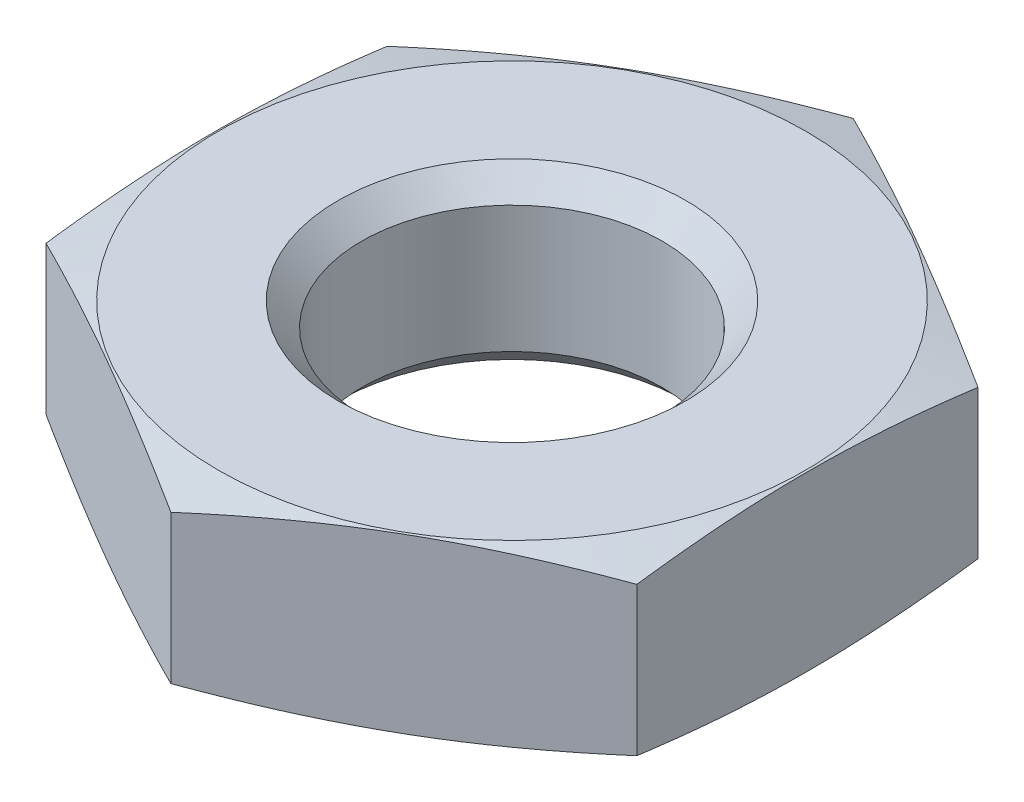
ISO-10303-21;
HEADER;
FILE_DESCRIPTION(('STEP AP214'),'2;1');
FILE_NAME('part.step','',(''),(''),'','','');
FILE_SCHEMA(('AUTOMOTIVE_DESIGN { 1 0 10303 214 1 1 1 1 }'));
ENDSEC;
DATA;
#1=APPLICATION_CONTEXT('core data for automotive mechanical design processes');
#2=APPLICATION_PROTOCOL_DEFINITION('international standard','automotive_design',2000,#1);
#3=PRODUCT_CONTEXT('',#1,'mechanical');
#4=PRODUCT('Part','Part','',(#3));
#5=PRODUCT_RELATED_PRODUCT_CATEGORY('part','',(#4));
#6=PRODUCT_DEFINITION_FORMATION('','',#4);
#7=PRODUCT_DEFINITION_CONTEXT('part definition',#1,'design');
#8=PRODUCT_DEFINITION('design','',#6,#7);
#9=PRODUCT_DEFINITION_SHAPE('','',#8);
#10=(LENGTH_UNIT() NAMED_UNIT(*) SI_UNIT(.MILLI.,.METRE.));
#11=(NAMED_UNIT(*) PLANE_ANGLE_UNIT() SI_UNIT($,.RADIAN.));
#12=(NAMED_UNIT(*) SI_UNIT($,.STERADIAN.) SOLID_ANGLE_UNIT());
#13=UNCERTAINTY_MEASURE_WITH_UNIT(LENGTH_MEASURE(1.E-05),#10,'distance_accuracy_value','');
#14=(GEOMETRIC_REPRESENTATION_CONTEXT(3) GLOBAL_UNCERTAINTY_ASSIGNED_CONTEXT((#13)) GLOBAL_UNIT_ASSIGNED_CONTEXT((#10,
#11,#12)) REPRESENTATION_CONTEXT('',''));
#15=CARTESIAN_POINT('',(0.,0.,0.));
#16=DIRECTION('',(0.,0.,1.));
#17=DIRECTION('',(1.,0.,0.));
#18=AXIS2_PLACEMENT_3D('',#15,#16,#17);
#19=CARTESIAN_POINT('',(0.,-2.5,0.));
#20=DIRECTION('',(0.,-1.,0.));
#21=DIRECTION('',(0.,0.,-1.));
#22=AXIS2_PLACEMENT_3D('',#19,#20,#21);
#23=CONICAL_SURFACE('',#22,17.780127018922,1.30899693899574);
#24=CARTESIAN_POINT('',(0.,0.,0.));
#25=DIRECTION('',(0.,-1.,0.));
#26=DIRECTION('',(0.,0.,-1.));
#27=AXIS2_PLACEMENT_3D('',#24,#25,#26);
#28=CIRCLE('',#27,8.45);
#29=CARTESIAN_POINT('',(0.,0.,-8.45));
#30=VERTEX_POINT('',#29);
#31=EDGE_CURVE('E119',#30,#30,#28,.T.);
#32=ORIENTED_EDGE('',*,*,#31,.T.);
#33=EDGE_LOOP('',(#32));
#34=FACE_BOUND('',#33,.T.);
#35=CARTESIAN_POINT('',(0.000200000000000109,-0.365769417057959,-9.81507004627744));
#36=CARTESIAN_POINT('',(-0.352800229244585,-0.311137500905046,-9.61126526889908));
#37=CARTESIAN_POINT('',(-0.706440481475503,-0.261540764749273,-9.40709097407727));
#38=CARTESIAN_POINT('',(-1.41496987394528,-0.174403984325089,-8.99802133860609));
#39=CARTESIAN_POINT('',(-1.76985946244938,-0.136868837078632,-8.79312573915065));
#40=CARTESIAN_POINT('',(-2.47873586595203,-0.0760464794968255,-8.38385575676622));
#41=CARTESIAN_POINT('',(-2.83271788769515,-0.052686737057327,-8.17948414122454));
#42=CARTESIAN_POINT('',(-3.5411333400369,-0.0213637164939934,-7.77048028911695));
#43=CARTESIAN_POINT('',(-3.89556667001845,-0.0133974596215508,-7.56584811064232));
#44=CARTESIAN_POINT('',(-4.60443332998155,-0.0133974596215514,-7.15658375369308));
#45=CARTESIAN_POINT('',(-4.9588666599631,-0.0213637164939946,-6.95195157521845));
#46=CARTESIAN_POINT('',(-5.66728211230485,-0.0526867370573296,-6.54294772311086));
#47=CARTESIAN_POINT('',(-6.02126413404797,-0.0760464794968291,-6.33857610756918));
#48=CARTESIAN_POINT('',(-6.73014053755062,-0.136868837078638,-5.92930612518475));
#49=CARTESIAN_POINT('',(-7.08503012605472,-0.174403984325095,-5.72441052572931));
#50=CARTESIAN_POINT('',(-7.7935595185245,-0.261540764749279,-5.31534089025813));
#51=CARTESIAN_POINT('',(-8.14719977075542,-0.311137500905053,-5.11116659543632));
#52=CARTESIAN_POINT('',(-8.5002,-0.365769417057967,-4.90736181805796));
#53=B_SPLINE_CURVE_WITH_KNOTS('',3,(#35,#36,#37,#38,#39,#40,#41,#42,#43,#44,#45,#46,#47,#48,#49,
#50,#51,#52),.UNSPECIFIED.,.F.,.F.,(4,2,2,2,2,2,2,2,4),(0.,1.23382789118024,2.46815608714628,
3.69611406802288,4.92383440651826,6.15155474501363,7.37951272589024,8.61384092185627,
9.84766881303652),.UNSPECIFIED.);
#54=CARTESIAN_POINT('',(0.,-0.365738476404288,-9.8149545762236));
#55=VERTEX_POINT('',#54);
#56=CARTESIAN_POINT('',(-8.5,-0.365738476404295,-4.9074772881118));
#57=VERTEX_POINT('',#56);
#58=EDGE_CURVE('E115',#55,#57,#53,.T.);
#59=ORIENTED_EDGE('',*,*,#58,.T.);
#60=CARTESIAN_POINT('',(-8.5,-2.3639247544871,-15.0360203576041));
#61=CARTESIAN_POINT('',(-8.5,-2.27937012825233,-14.6734757623121));
#62=CARTESIAN_POINT('',(-8.5,-2.19549646796284,-14.3107707804528));
#63=CARTESIAN_POINT('',(-8.5,-2.0294208773786,-13.5849725191364));
#64=CARTESIAN_POINT('',(-8.5,-1.94721897348251,-13.2218792336429));
#65=CARTESIAN_POINT('',(-8.5,-1.78478445296961,-12.4951814894489));
#66=CARTESIAN_POINT('',(-8.5,-1.70455220114447,-12.1315769490497));
#67=CARTESIAN_POINT('',(-8.5,-1.54648067543351,-11.4038483267945));
#68=CARTESIAN_POINT('',(-8.5,-1.46864139395058,-11.0397242465918));
#69=CARTESIAN_POINT('',(-8.5,-1.31511895411883,-10.3073340320132));
#70=CARTESIAN_POINT('',(-8.5,-1.23946401682463,-9.93906196641482));
#71=CARTESIAN_POINT('',(-8.5,-1.09175910745215,-9.20179613896365));
#72=CARTESIAN_POINT('',(-8.5,-1.01970910749613,-8.83280238271478));
#73=CARTESIAN_POINT('',(-8.5,-0.880018719786806,-8.09393326140461));
#74=CARTESIAN_POINT('',(-8.5,-0.812378843490324,-7.72405779922671));
#75=CARTESIAN_POINT('',(-8.5,-0.682524066993284,-6.98335024552972));
#76=CARTESIAN_POINT('',(-8.5,-0.620309164849639,-6.61251815435333));
#77=CARTESIAN_POINT('',(-8.5,-0.50413892873905,-5.87997045960093));
#78=CARTESIAN_POINT('',(-8.5,-0.450003961095086,-5.51828353942051));
#79=CARTESIAN_POINT('',(-8.5,-0.349330847237729,-4.79384411222864));
#80=CARTESIAN_POINT('',(-8.5,-0.302792702235557,-4.4310916050473));
#81=CARTESIAN_POINT('',(-8.5,-0.2187650946796,-3.70462077137001));
#82=CARTESIAN_POINT('',(-8.5,-0.181273351458898,-3.3409027117237));
#83=CARTESIAN_POINT('',(-8.5,-0.116770610619293,-2.61254160313833));
#84=CARTESIAN_POINT('',(-8.5,-0.0897591451929583,-2.24789859621755));
#85=CARTESIAN_POINT('',(-8.5,-0.0475541537350256,-1.51956392735025));
#86=CARTESIAN_POINT('',(-8.5,-0.0323080208991871,-1.15587536295004));
#87=CARTESIAN_POINT('',(-8.5,-0.0142192230736951,-0.428186648910902));
#88=CARTESIAN_POINT('',(-8.5,-0.0113764882642169,-0.0641865010374335));
#89=CARTESIAN_POINT('',(-8.5,-0.0182502334673587,0.663718269423194));
#90=CARTESIAN_POINT('',(-8.5,-0.0279675543871868,1.02762288398274));
#91=CARTESIAN_POINT('',(-8.5,-0.0594410430176242,1.75489855726968));
#92=CARTESIAN_POINT('',(-8.5,-0.0811971991364327,2.11826961651048));
#93=CARTESIAN_POINT('',(-8.5,-0.147829156542609,3.00566017974477));
#94=CARTESIAN_POINT('',(-8.5,-0.19868449558031,3.52923079842505));
#95=CARTESIAN_POINT('',(-8.5,-0.319137315402589,4.57413032092251));
#96=CARTESIAN_POINT('',(-8.5,-0.38873430605718,5.09545928300111));
#97=CARTESIAN_POINT('',(-8.5,-0.542670339854274,6.13767893630393));
#98=CARTESIAN_POINT('',(-8.5,-0.627057752776347,6.65856237328509));
#99=CARTESIAN_POINT('',(-8.5,-0.806830622464431,7.69839836943751));
#100=CARTESIAN_POINT('',(-8.5,-0.9022159614066,8.21735094923309));
#101=CARTESIAN_POINT('',(-8.5,-1.10332786619336,9.26458573455643));
#102=CARTESIAN_POINT('',(-8.5,-1.20923006614953,9.79283394970204));
#103=CARTESIAN_POINT('',(-8.5,-1.42747179045802,10.8479976028115));
#104=CARTESIAN_POINT('',(-8.5,-1.53981139317672,11.374913024469));
#105=CARTESIAN_POINT('',(-8.5,-1.76871242996661,12.4246853211046));
#106=CARTESIAN_POINT('',(-8.5,-1.88524623727985,12.947548241208));
#107=CARTESIAN_POINT('',(-8.5,-2.06282540366486,13.7311913891819));
#108=CARTESIAN_POINT('',(-8.5,-2.12247945448448,13.9922883452165));
#109=CARTESIAN_POINT('',(-8.5,-2.2426106848092,14.5142916127147));
#110=CARTESIAN_POINT('',(-8.5,-2.30308786050588,14.7751979250545));
#111=CARTESIAN_POINT('',(-8.5,-2.3639247544871,15.0360203576041));
#112=B_SPLINE_CURVE_WITH_KNOTS('',3,(#60,#61,#62,#63,#64,#65,#66,#67,#68,#69,#70,#71,#72,#73,
#74,#75,#76,#77,#78,#79,#80,#81,#82,#83,#84,#85,#86,#87,#88,#89,#90,#91,#92,#93,#94,#95,#96,#97,
#98,#99,#100,#101,#102,#103,#104,#105,#106,#107,#108,#109,#110,#111),.UNSPECIFIED.,.F.,.F.,(4,2,
2,2,2,2,2,2,2,2,2,2,2,2,2,2,2,2,2,2,2,2,2,2,2,4),(0.,1.11682417611697,2.23366597429916,
3.35071308134477,4.46775664166398,5.59563027187189,6.72349517864314,7.85149065587533,
8.97948572908639,10.0765667669556,11.173647979741,12.270452320321,13.3672076972881,
14.4590302277838,15.5508466123061,16.6427360987194,17.7346245337898,19.3122750761973,
20.8898843640359,22.4727526704249,24.0556040206807,25.6718286623336,27.2880729834416,
28.8951304493104,29.6986044141633,30.5020746627873),.UNSPECIFIED.);
#113=CARTESIAN_POINT('',(-8.5,-0.365738476404295,4.9074772881118));
#114=VERTEX_POINT('',#113);
#115=EDGE_CURVE('E108',#57,#114,#112,.T.);
#116=ORIENTED_EDGE('',*,*,#115,.T.);
#117=CARTESIAN_POINT('',(-8.5002,-0.365769417057967,4.90736181805796));
#118=CARTESIAN_POINT('',(-8.14719977075542,-0.311137500905053,5.11116659543632));
#119=CARTESIAN_POINT('',(-7.7935595185245,-0.261540764749279,5.31534089025813));
#120=CARTESIAN_POINT('',(-7.08503012605472,-0.174403984325094,5.72441052572931));
#121=CARTESIAN_POINT('',(-6.73014053755062,-0.136868837078637,5.92930612518475));
#122=CARTESIAN_POINT('',(-6.02126413404797,-0.0760464794968289,6.33857610756918));
#123=CARTESIAN_POINT('',(-5.66728211230485,-0.05268673705733,6.54294772311086));
#124=CARTESIAN_POINT('',(-4.9588666599631,-0.0213637164939952,6.95195157521845));
#125=CARTESIAN_POINT('',(-4.60443332998155,-0.0133974596215518,7.15658375369308));
#126=CARTESIAN_POINT('',(-3.89556667001845,-0.0133974596215507,7.56584811064232));
#127=CARTESIAN_POINT('',(-3.5411333400369,-0.021363716493993,7.77048028911695));
#128=CARTESIAN_POINT('',(-2.83271788769515,-0.0526867370573266,8.17948414122455));
#129=CARTESIAN_POINT('',(-2.47873586595203,-0.0760464794968255,8.38385575676622));
#130=CARTESIAN_POINT('',(-1.76985946244938,-0.136868837078633,8.79312573915065));
#131=CARTESIAN_POINT('',(-1.41496987394528,-0.174403984325089,8.99802133860609));
#132=CARTESIAN_POINT('',(-0.7064404814755,-0.261540764749272,9.40709097407727));
#133=CARTESIAN_POINT('',(-0.352800229244583,-0.311137500905045,9.61126526889908));
#134=CARTESIAN_POINT('',(0.000200000000002859,-0.36576941705796,9.81507004627744));
#135=B_SPLINE_CURVE_WITH_KNOTS('',3,(#117,#118,#119,#120,#121,#122,#123,#124,#125,#126,#127,
#128,#129,#130,#131,#132,#133,#134),.UNSPECIFIED.,.F.,.F.,(4,2,2,2,2,2,2,2,4),(0.,
1.23382789118024,2.46815608714628,3.69611406802288,4.92383440651826,6.15155474501364,
7.37951272589024,8.61384092185628,9.84766881303652),.UNSPECIFIED.);
#136=CARTESIAN_POINT('',(0.,-0.365738476404288,9.8149545762236));
#137=VERTEX_POINT('',#136);
#138=EDGE_CURVE('E97',#114,#137,#135,.T.);
#139=ORIENTED_EDGE('',*,*,#138,.T.);
#140=CARTESIAN_POINT('',(-0.000200000000000109,-0.365769417057959,9.81507004627744));
#141=CARTESIAN_POINT('',(0.352800229244585,-0.311137500905046,9.61126526889908));
#142=CARTESIAN_POINT('',(0.706440481475503,-0.261540764749273,9.40709097407727));
#143=CARTESIAN_POINT('',(1.41496987394528,-0.174403984325089,8.99802133860609));
#144=CARTESIAN_POINT('',(1.76985946244938,-0.136868837078632,8.79312573915065));
#145=CARTESIAN_POINT('',(2.47873586595203,-0.0760464794968255,8.38385575676622));
#146=CARTESIAN_POINT('',(2.83271788769515,-0.052686737057327,8.17948414122454));
#147=CARTESIAN_POINT('',(3.5411333400369,-0.0213637164939934,7.77048028911695));
#148=CARTESIAN_POINT('',(3.89556667001845,-0.0133974596215508,7.56584811064232));
#149=CARTESIAN_POINT('',(4.60443332998155,-0.0133974596215514,7.15658375369308));
#150=CARTESIAN_POINT('',(4.9588666599631,-0.0213637164939946,6.95195157521845));
#151=CARTESIAN_POINT('',(5.66728211230485,-0.0526867370573296,6.54294772311086));
#152=CARTESIAN_POINT('',(6.02126413404797,-0.0760464794968291,6.33857610756918));
#153=CARTESIAN_POINT('',(6.73014053755062,-0.136868837078638,5.92930612518475));
#154=CARTESIAN_POINT('',(7.08503012605472,-0.174403984325095,5.72441052572931));
#155=CARTESIAN_POINT('',(7.7935595185245,-0.261540764749279,5.31534089025813));
#156=CARTESIAN_POINT('',(8.14719977075542,-0.311137500905053,5.11116659543632));
#157=CARTESIAN_POINT('',(8.5002,-0.365769417057967,4.90736181805796));
#158=B_SPLINE_CURVE_WITH_KNOTS('',3,(#140,#141,#142,#143,#144,#145,#146,#147,#148,#149,#150,
#151,#152,#153,#154,#155,#156,#157),.UNSPECIFIED.,.F.,.F.,(4,2,2,2,2,2,2,2,4),(0.,
1.23382789118024,2.46815608714628,3.69611406802288,4.92383440651826,6.15155474501363,
7.37951272589024,8.61384092185627,9.84766881303652),.UNSPECIFIED.);
#159=CARTESIAN_POINT('',(8.5,-0.365738476404295,4.9074772881118));
#160=VERTEX_POINT('',#159);
#161=EDGE_CURVE('E102',#137,#160,#158,.T.);
#162=ORIENTED_EDGE('',*,*,#161,.T.);
#163=CARTESIAN_POINT('',(8.5,-2.3639247544871,15.0360203576041));
#164=CARTESIAN_POINT('',(8.5,-2.27937012825233,14.6734757623121));
#165=CARTESIAN_POINT('',(8.5,-2.19549646796284,14.3107707804528));
#166=CARTESIAN_POINT('',(8.5,-2.0294208773786,13.5849725191364));
#167=CARTESIAN_POINT('',(8.5,-1.94721897348251,13.2218792336429));
#168=CARTESIAN_POINT('',(8.5,-1.78478445296961,12.4951814894489));
#169=CARTESIAN_POINT('',(8.5,-1.70455220114447,12.1315769490497));
#170=CARTESIAN_POINT('',(8.5,-1.54648067543351,11.4038483267945));
#171=CARTESIAN_POINT('',(8.5,-1.46864139395058,11.0397242465918));
#172=CARTESIAN_POINT('',(8.5,-1.31511895411883,10.3073340320132));
#173=CARTESIAN_POINT('',(8.5,-1.23946401682463,9.93906196641482));
#174=CARTESIAN_POINT('',(8.5,-1.09175910745215,9.20179613896365));
#175=CARTESIAN_POINT('',(8.5,-1.01970910749613,8.83280238271478));
#176=CARTESIAN_POINT('',(8.5,-0.880018719786806,8.09393326140461));
#177=CARTESIAN_POINT('',(8.5,-0.812378843490324,7.72405779922671));
#178=CARTESIAN_POINT('',(8.5,-0.682524066993284,6.98335024552972));
#179=CARTESIAN_POINT('',(8.5,-0.620309164849639,6.61251815435333));
#180=CARTESIAN_POINT('',(8.5,-0.50413892873905,5.87997045960093));
#181=CARTESIAN_POINT('',(8.5,-0.450003961095086,5.51828353942051));
#182=CARTESIAN_POINT('',(8.5,-0.349330847237729,4.79384411222864));
#183=CARTESIAN_POINT('',(8.5,-0.302792702235557,4.4310916050473));
#184=CARTESIAN_POINT('',(8.5,-0.2187650946796,3.70462077137001));
#185=CARTESIAN_POINT('',(8.5,-0.181273351458898,3.3409027117237));
#186=CARTESIAN_POINT('',(8.5,-0.116770610619293,2.61254160313833));
#187=CARTESIAN_POINT('',(8.5,-0.0897591451929583,2.24789859621755));
#188=CARTESIAN_POINT('',(8.5,-0.0475541537350256,1.51956392735025));
#189=CARTESIAN_POINT('',(8.5,-0.0323080208991871,1.15587536295004));
#190=CARTESIAN_POINT('',(8.5,-0.0142192230736951,0.428186648910902));
#191=CARTESIAN_POINT('',(8.5,-0.0113764882642169,0.0641865010374335));
#192=CARTESIAN_POINT('',(8.5,-0.0182502334673587,-0.663718269423194));
#193=CARTESIAN_POINT('',(8.5,-0.0279675543871868,-1.02762288398274));
#194=CARTESIAN_POINT('',(8.5,-0.0594410430176242,-1.75489855726968));
#195=CARTESIAN_POINT('',(8.5,-0.0811971991364327,-2.11826961651048));
#196=CARTESIAN_POINT('',(8.5,-0.147829156542609,-3.00566017974477));
#197=CARTESIAN_POINT('',(8.5,-0.19868449558031,-3.52923079842505));
#198=CARTESIAN_POINT('',(8.5,-0.319137315402589,-4.57413032092251));
#199=CARTESIAN_POINT('',(8.5,-0.38873430605718,-5.09545928300111));
#200=CARTESIAN_POINT('',(8.5,-0.542670339854274,-6.13767893630393));
#201=CARTESIAN_POINT('',(8.5,-0.627057752776347,-6.65856237328509));
#202=CARTESIAN_POINT('',(8.5,-0.806830622464431,-7.69839836943751));
#203=CARTESIAN_POINT('',(8.5,-0.9022159614066,-8.21735094923309));
#204=CARTESIAN_POINT('',(8.5,-1.10332786619336,-9.26458573455643));
#205=CARTESIAN_POINT('',(8.5,-1.20923006614953,-9.79283394970204));
#206=CARTESIAN_POINT('',(8.5,-1.42747179045802,-10.8479976028115));
#207=CARTESIAN_POINT('',(8.5,-1.53981139317672,-11.374913024469));
#208=CARTESIAN_POINT('',(8.5,-1.76871242996661,-12.4246853211046));
#209=CARTESIAN_POINT('',(8.5,-1.88524623727985,-12.947548241208));
#210=CARTESIAN_POINT('',(8.5,-2.06282540366486,-13.7311913891819));
#211=CARTESIAN_POINT('',(8.5,-2.12247945448448,-13.9922883452165));
#212=CARTESIAN_POINT('',(8.5,-2.2426106848092,-14.5142916127147));
#213=CARTESIAN_POINT('',(8.5,-2.30308786050588,-14.7751979250545));
#214=CARTESIAN_POINT('',(8.5,-2.3639247544871,-15.0360203576041));
#215=B_SPLINE_CURVE_WITH_KNOTS('',3,(#163,#164,#165,#166,#167,#168,#169,#170,#171,#172,#173,
#174,#175,#176,#177,#178,#179,#180,#181,#182,#183,#184,#185,#186,#187,#188,#189,#190,#191,#192,
#193,#194,#195,#196,#197,#198,#199,#200,#201,#202,#203,#204,#205,#206,#207,#208,#209,#210,#211,
#212,#213,#214),.UNSPECIFIED.,.F.,.F.,(4,2,2,2,2,2,2,2,2,2,2,2,2,2,2,2,2,2,2,2,2,2,2,2,2,4),(0.,
1.11682417611697,2.23366597429916,3.35071308134477,4.46775664166398,5.59563027187189,
6.72349517864314,7.85149065587533,8.97948572908639,10.0765667669556,11.173647979741,
12.270452320321,13.3672076972881,14.4590302277838,15.5508466123061,16.6427360987194,
17.7346245337898,19.3122750761973,20.8898843640359,22.4727526704249,24.0556040206807,
25.6718286623336,27.2880729834416,28.8951304493104,29.6986044141633,30.5020746627873),.UNSPECIFIED.);
#216=CARTESIAN_POINT('',(8.5,-0.365738476404295,-4.9074772881118));
#217=VERTEX_POINT('',#216);
#218=EDGE_CURVE('E205',#160,#217,#215,.T.);
#219=ORIENTED_EDGE('',*,*,#218,.T.);
#220=CARTESIAN_POINT('',(8.5002,-0.365769417057967,-4.90736181805796));
#221=CARTESIAN_POINT('',(8.14719977075542,-0.311137500905053,-5.11116659543632));
#222=CARTESIAN_POINT('',(7.7935595185245,-0.261540764749279,-5.31534089025813));
#223=CARTESIAN_POINT('',(7.08503012605472,-0.174403984325094,-5.72441052572931));
#224=CARTESIAN_POINT('',(6.73014053755062,-0.136868837078637,-5.92930612518475));
#225=CARTESIAN_POINT('',(6.02126413404797,-0.0760464794968289,-6.33857610756918));
#226=CARTESIAN_POINT('',(5.66728211230485,-0.05268673705733,-6.54294772311086));
#227=CARTESIAN_POINT('',(4.9588666599631,-0.0213637164939952,-6.95195157521845));
#228=CARTESIAN_POINT('',(4.60443332998155,-0.0133974596215518,-7.15658375369308));
#229=CARTESIAN_POINT('',(3.89556667001845,-0.0133974596215507,-7.56584811064232));
#230=CARTESIAN_POINT('',(3.5411333400369,-0.021363716493993,-7.77048028911695));
#231=CARTESIAN_POINT('',(2.83271788769515,-0.0526867370573266,-8.17948414122455));
#232=CARTESIAN_POINT('',(2.47873586595203,-0.0760464794968255,-8.38385575676622));
#233=CARTESIAN_POINT('',(1.76985946244938,-0.136868837078633,-8.79312573915065));
#234=CARTESIAN_POINT('',(1.41496987394528,-0.174403984325089,-8.99802133860609));
#235=CARTESIAN_POINT('',(0.7064404814755,-0.261540764749272,-9.40709097407727));
#236=CARTESIAN_POINT('',(0.352800229244583,-0.311137500905045,-9.61126526889908));
#237=CARTESIAN_POINT('',(-0.000200000000002859,-0.36576941705796,-9.81507004627744));
#238=B_SPLINE_CURVE_WITH_KNOTS('',3,(#220,#221,#222,#223,#224,#225,#226,#227,#228,#229,#230,
#231,#232,#233,#234,#235,#236,#237),.UNSPECIFIED.,.F.,.F.,(4,2,2,2,2,2,2,2,4),(0.,
1.23382789118024,2.46815608714628,3.69611406802288,4.92383440651826,6.15155474501364,
7.37951272589024,8.61384092185628,9.84766881303652),.UNSPECIFIED.);
#239=EDGE_CURVE('E121',#217,#55,#238,.T.);
#240=ORIENTED_EDGE('',*,*,#239,.T.);
#241=EDGE_LOOP('',(#59,#116,#139,#162,#219,#240));
#242=FACE_BOUND('',#241,.T.);
#243=ADVANCED_FACE('F41',(#34,#242),#23,.T.);
#244=CARTESIAN_POINT('',(0.,0.,0.));
#245=DIRECTION('',(0.,1.,0.));
#246=DIRECTION('',(0.,0.,1.));
#247=AXIS2_PLACEMENT_3D('',#244,#245,#246);
#248=PLANE('',#247);
#249=CARTESIAN_POINT('',(0.,0.,0.));
#250=DIRECTION('',(0.,1.,0.));
#251=DIRECTION('',(0.,0.,1.));
#252=AXIS2_PLACEMENT_3D('',#249,#250,#251);
#253=CIRCLE('',#252,5.);
#254=CARTESIAN_POINT('',(0.,0.,5.));
#255=VERTEX_POINT('',#254);
#256=EDGE_CURVE('E111',#255,#255,#253,.T.);
#257=ORIENTED_EDGE('',*,*,#256,.F.);
#258=EDGE_LOOP('',(#257));
#259=FACE_BOUND('',#258,.T.);
#260=ORIENTED_EDGE('',*,*,#31,.F.);
#261=EDGE_LOOP('',(#260));
#262=FACE_BOUND('',#261,.T.);
#263=ADVANCED_FACE('F43',(#259,#262),#248,.T.);
#264=CARTESIAN_POINT('',(-8.5,-6.,-4.9074772881118));
#265=DIRECTION('',(-1.,0.,0.));
#266=DIRECTION('',(0.,0.,1.));
#267=AXIS2_PLACEMENT_3D('',#264,#265,#266);
#268=PLANE('',#267);
#269=DIRECTION('',(0.,1.,0.));
#270=VECTOR('',#269,1.);
#271=CARTESIAN_POINT('',(-8.5,-6.,-4.9074772881118));
#272=LINE('',#271,#270);
#273=CARTESIAN_POINT('',(-8.5,-4.63426152359571,-4.9074772881118));
#274=VERTEX_POINT('',#273);
#275=EDGE_CURVE('E103',#274,#57,#272,.T.);
#276=ORIENTED_EDGE('',*,*,#275,.F.);
#277=CARTESIAN_POINT('',(-8.5,-2.6360752455129,15.0360203576041));
#278=CARTESIAN_POINT('',(-8.5,-2.72062987174767,14.6734757623121));
#279=CARTESIAN_POINT('',(-8.5,-2.80450353203716,14.3107707804528));
#280=CARTESIAN_POINT('',(-8.5,-2.9705791226214,13.5849725191364));
#281=CARTESIAN_POINT('',(-8.5,-3.05278102651749,13.2218792336429));
#282=CARTESIAN_POINT('',(-8.5,-3.21521554703039,12.4951814894489));
#283=CARTESIAN_POINT('',(-8.5,-3.29544779885553,12.1315769490497));
#284=CARTESIAN_POINT('',(-8.5,-3.45351932456649,11.4038483267945));
#285=CARTESIAN_POINT('',(-8.5,-3.53135860604942,11.0397242465918));
#286=CARTESIAN_POINT('',(-8.5,-3.68488104588117,10.3073340320132));
#287=CARTESIAN_POINT('',(-8.5,-3.76053598317537,9.93906196641482));
#288=CARTESIAN_POINT('',(-8.5,-3.90824089254785,9.20179613896365));
#289=CARTESIAN_POINT('',(-8.5,-3.98029089250387,8.83280238271478));
#290=CARTESIAN_POINT('',(-8.5,-4.11998128021319,8.09393326140461));
#291=CARTESIAN_POINT('',(-8.5,-4.18762115650968,7.72405779922671));
#292=CARTESIAN_POINT('',(-8.5,-4.31747593300672,6.98335024552972));
#293=CARTESIAN_POINT('',(-8.5,-4.37969083515036,6.61251815435333));
#294=CARTESIAN_POINT('',(-8.5,-4.49586107126095,5.87997045960093));
#295=CARTESIAN_POINT('',(-8.5,-4.54999603890492,5.51828353942051));
#296=CARTESIAN_POINT('',(-8.5,-4.65066915276227,4.79384411222864));
#297=CARTESIAN_POINT('',(-8.5,-4.69720729776444,4.43109160504731));
#298=CARTESIAN_POINT('',(-8.5,-4.7812349053204,3.70462077137001));
#299=CARTESIAN_POINT('',(-8.5,-4.8187266485411,3.34090271172371));
#300=CARTESIAN_POINT('',(-8.5,-4.88322938938071,2.61254160313833));
#301=CARTESIAN_POINT('',(-8.5,-4.91024085480704,2.24789859621756));
#302=CARTESIAN_POINT('',(-8.5,-4.95244584626498,1.51956392735025));
#303=CARTESIAN_POINT('',(-8.5,-4.96769197910081,1.15587536295004));
#304=CARTESIAN_POINT('',(-8.5,-4.98578077692631,0.428186648910902));
#305=CARTESIAN_POINT('',(-8.5,-4.98862351173578,0.0641865010374339));
#306=CARTESIAN_POINT('',(-8.5,-4.98174976653264,-0.663718269423194));
#307=CARTESIAN_POINT('',(-8.5,-4.97203244561281,-1.02762288398275));
#308=CARTESIAN_POINT('',(-8.5,-4.94055895698238,-1.75489855726968));
#309=CARTESIAN_POINT('',(-8.5,-4.91880280086357,-2.11826961651048));
#310=CARTESIAN_POINT('',(-8.5,-4.85217084345739,-3.00566017974477));
#311=CARTESIAN_POINT('',(-8.5,-4.80131550441969,-3.52923079842505));
#312=CARTESIAN_POINT('',(-8.5,-4.68086268459741,-4.57413032092251));
#313=CARTESIAN_POINT('',(-8.5,-4.61126569394282,-5.09545928300111));
#314=CARTESIAN_POINT('',(-8.5,-4.45732966014573,-6.13767893630393));
#315=CARTESIAN_POINT('',(-8.5,-4.37294224722365,-6.65856237328509));
#316=CARTESIAN_POINT('',(-8.5,-4.19316937753557,-7.69839836943751));
#317=CARTESIAN_POINT('',(-8.5,-4.0977840385934,-8.21735094923309));
#318=CARTESIAN_POINT('',(-8.5,-3.89667213380664,-9.26458573455643));
#319=CARTESIAN_POINT('',(-8.5,-3.79076993385047,-9.79283394970204));
#320=CARTESIAN_POINT('',(-8.5,-3.57252820954198,-10.8479976028115));
#321=CARTESIAN_POINT('',(-8.5,-3.46018860682328,-11.374913024469));
#322=CARTESIAN_POINT('',(-8.5,-3.23128757003339,-12.4246853211046));
#323=CARTESIAN_POINT('',(-8.5,-3.11475376272015,-12.947548241208));
#324=CARTESIAN_POINT('',(-8.5,-2.93717459633514,-13.7311913891819));
#325=CARTESIAN_POINT('',(-8.5,-2.87752054551552,-13.9922883452165));
#326=CARTESIAN_POINT('',(-8.5,-2.75738931519081,-14.5142916127147));
#327=CARTESIAN_POINT('',(-8.5,-2.69691213949412,-14.7751979250545));
#328=CARTESIAN_POINT('',(-8.5,-2.6360752455129,-15.0360203576041));
#329=B_SPLINE_CURVE_WITH_KNOTS('',3,(#277,#278,#279,#280,#281,#282,#283,#284,#285,#286,#287,
#288,#289,#290,#291,#292,#293,#294,#295,#296,#297,#298,#299,#300,#301,#302,#303,#304,#305,#306,
#307,#308,#309,#310,#311,#312,#313,#314,#315,#316,#317,#318,#319,#320,#321,#322,#323,#324,#325,
#326,#327,#328),.UNSPECIFIED.,.F.,.F.,(4,2,2,2,2,2,2,2,2,2,2,2,2,2,2,2,2,2,2,2,2,2,2,2,2,4),(0.,
1.11682417611697,2.23366597429916,3.35071308134477,4.46775664166398,5.59563027187189,
6.72349517864314,7.85149065587533,8.97948572908639,10.0765667669556,11.173647979741,
12.270452320321,13.3672076972881,14.4590302277838,15.5508466123061,16.6427360987194,
17.7346245337898,19.3122750761973,20.8898843640358,22.4727526704249,24.0556040206807,
25.6718286623336,27.2880729834416,28.8951304493104,29.6986044141633,30.5020746627873),.UNSPECIFIED.);
#330=CARTESIAN_POINT('',(-8.5,-4.63426152359571,4.9074772881118));
#331=VERTEX_POINT('',#330);
#332=EDGE_CURVE('E11',#331,#274,#329,.T.);
#333=ORIENTED_EDGE('',*,*,#332,.F.);
#334=DIRECTION('',(0.,1.,0.));
#335=VECTOR('',#334,1.);
#336=CARTESIAN_POINT('',(-8.5,-6.,4.9074772881118));
#337=LINE('',#336,#335);
#338=EDGE_CURVE('E67',#331,#114,#337,.T.);
#339=ORIENTED_EDGE('',*,*,#338,.T.);
#340=ORIENTED_EDGE('',*,*,#115,.F.);
#341=EDGE_LOOP('',(#276,#333,#339,#340));
#342=FACE_BOUND('',#341,.T.);
#343=ADVANCED_FACE('F107',(#342),#268,.T.);
#344=CARTESIAN_POINT('',(0.,-6.,-9.8149545762236));
#345=DIRECTION('',(-0.499999999999999,0.,-0.866025403784439));
#346=DIRECTION('',(-0.866025403784439,0.,0.499999999999999));
#347=AXIS2_PLACEMENT_3D('',#344,#345,#346);
#348=PLANE('',#347);
#349=DIRECTION('',(0.,1.,0.));
#350=VECTOR('',#349,1.);
#351=CARTESIAN_POINT('',(0.,-6.,-9.8149545762236));
#352=LINE('',#351,#350);
#353=CARTESIAN_POINT('',(0.,-4.63426152359571,-9.8149545762236));
#354=VERTEX_POINT('',#353);
#355=EDGE_CURVE('E246',#354,#55,#352,.T.);
#356=ORIENTED_EDGE('',*,*,#355,.F.);
#357=CARTESIAN_POINT('',(-8.5002,-4.63423058294203,-4.90736181805796));
#358=CARTESIAN_POINT('',(-8.14719977075542,-4.68886249909495,-5.11116659543632));
#359=CARTESIAN_POINT('',(-7.7935595185245,-4.73845923525072,-5.31534089025813));
#360=CARTESIAN_POINT('',(-7.08503012605472,-4.82559601567491,-5.72441052572931));
#361=CARTESIAN_POINT('',(-6.73014053755062,-4.86313116292136,-5.92930612518475));
#362=CARTESIAN_POINT('',(-6.02126413404797,-4.92395352050317,-6.33857610756918));
#363=CARTESIAN_POINT('',(-5.66728211230485,-4.94731326294267,-6.54294772311086));
#364=CARTESIAN_POINT('',(-4.9588666599631,-4.97863628350601,-6.95195157521845));
#365=CARTESIAN_POINT('',(-4.60443332998155,-4.98660254037845,-7.15658375369308));
#366=CARTESIAN_POINT('',(-3.89556667001845,-4.98660254037845,-7.56584811064232));
#367=CARTESIAN_POINT('',(-3.5411333400369,-4.97863628350601,-7.77048028911695));
#368=CARTESIAN_POINT('',(-2.83271788769515,-4.94731326294267,-8.17948414122454));
#369=CARTESIAN_POINT('',(-2.47873586595203,-4.92395352050318,-8.38385575676622));
#370=CARTESIAN_POINT('',(-1.76985946244938,-4.86313116292137,-8.79312573915065));
#371=CARTESIAN_POINT('',(-1.41496987394528,-4.82559601567491,-8.99802133860609));
#372=CARTESIAN_POINT('',(-0.706440481475501,-4.73845923525073,-9.40709097407727));
#373=CARTESIAN_POINT('',(-0.352800229244584,-4.68886249909496,-9.61126526889908));
#374=CARTESIAN_POINT('',(0.00020000000000279,-4.63423058294204,-9.81507004627744));
#375=B_SPLINE_CURVE_WITH_KNOTS('',3,(#357,#358,#359,#360,#361,#362,#363,#364,#365,#366,#367,
#368,#369,#370,#371,#372,#373,#374),.UNSPECIFIED.,.F.,.F.,(4,2,2,2,2,2,2,2,4),(0.,
1.23382789118024,2.46815608714628,3.69611406802288,4.92383440651826,6.15155474501364,
7.37951272589024,8.61384092185628,9.84766881303652),.UNSPECIFIED.);
#376=EDGE_CURVE('E55',#274,#354,#375,.T.);
#377=ORIENTED_EDGE('',*,*,#376,.F.);
#378=ORIENTED_EDGE('',*,*,#275,.T.);
#379=ORIENTED_EDGE('',*,*,#58,.F.);
#380=EDGE_LOOP('',(#356,#377,#378,#379));
#381=FACE_BOUND('',#380,.T.);
#382=ADVANCED_FACE('F139',(#381),#348,.T.);
#383=CARTESIAN_POINT('',(8.5,-6.,-4.9074772881118));
#384=DIRECTION('',(0.499999999999999,0.,-0.866025403784439));
#385=DIRECTION('',(-0.866025403784439,0.,-0.499999999999999));
#386=AXIS2_PLACEMENT_3D('',#383,#384,#385);
#387=PLANE('',#386);
#388=DIRECTION('',(0.,1.,0.));
#389=VECTOR('',#388,1.);
#390=CARTESIAN_POINT('',(8.5,-6.,-4.9074772881118));
#391=LINE('',#390,#389);
#392=CARTESIAN_POINT('',(8.5,-4.63426152359571,-4.9074772881118));
#393=VERTEX_POINT('',#392);
#394=EDGE_CURVE('E248',#393,#217,#391,.T.);
#395=ORIENTED_EDGE('',*,*,#394,.F.);
#396=CARTESIAN_POINT('',(-0.0002,-4.63423058294204,-9.81507004627744));
#397=CARTESIAN_POINT('',(0.352800229244586,-4.68886249909496,-9.61126526889908));
#398=CARTESIAN_POINT('',(0.706440481475503,-4.73845923525073,-9.40709097407727));
#399=CARTESIAN_POINT('',(1.41496987394528,-4.82559601567491,-8.99802133860609));
#400=CARTESIAN_POINT('',(1.76985946244938,-4.86313116292137,-8.79312573915065));
#401=CARTESIAN_POINT('',(2.47873586595203,-4.92395352050318,-8.38385575676622));
#402=CARTESIAN_POINT('',(2.83271788769515,-4.94731326294268,-8.17948414122454));
#403=CARTESIAN_POINT('',(3.5411333400369,-4.97863628350601,-7.77048028911695));
#404=CARTESIAN_POINT('',(3.89556667001845,-4.98660254037845,-7.56584811064232));
#405=CARTESIAN_POINT('',(4.60443332998155,-4.98660254037845,-7.15658375369308));
#406=CARTESIAN_POINT('',(4.9588666599631,-4.97863628350601,-6.95195157521845));
#407=CARTESIAN_POINT('',(5.66728211230485,-4.94731326294267,-6.54294772311086));
#408=CARTESIAN_POINT('',(6.02126413404797,-4.92395352050317,-6.33857610756918));
#409=CARTESIAN_POINT('',(6.73014053755062,-4.86313116292136,-5.92930612518475));
#410=CARTESIAN_POINT('',(7.08503012605472,-4.82559601567491,-5.72441052572931));
#411=CARTESIAN_POINT('',(7.7935595185245,-4.73845923525072,-5.31534089025813));
#412=CARTESIAN_POINT('',(8.14719977075542,-4.68886249909495,-5.11116659543632));
#413=CARTESIAN_POINT('',(8.5002,-4.63423058294203,-4.90736181805796));
#414=B_SPLINE_CURVE_WITH_KNOTS('',3,(#396,#397,#398,#399,#400,#401,#402,#403,#404,#405,#406,
#407,#408,#409,#410,#411,#412,#413),.UNSPECIFIED.,.F.,.F.,(4,2,2,2,2,2,2,2,4),(0.,
1.23382789118024,2.46815608714628,3.69611406802288,4.92383440651826,6.15155474501364,
7.37951272589024,8.61384092185627,9.84766881303652),.UNSPECIFIED.);
#415=EDGE_CURVE('E176',#354,#393,#414,.T.);
#416=ORIENTED_EDGE('',*,*,#415,.F.);
#417=ORIENTED_EDGE('',*,*,#355,.T.);
#418=ORIENTED_EDGE('',*,*,#239,.F.);
#419=EDGE_LOOP('',(#395,#416,#417,#418));
#420=FACE_BOUND('',#419,.T.);
#421=ADVANCED_FACE('F190',(#420),#387,.T.);
#422=CARTESIAN_POINT('',(8.5,-6.,4.9074772881118));
#423=DIRECTION('',(1.,0.,0.));
#424=DIRECTION('',(0.,0.,-1.));
#425=AXIS2_PLACEMENT_3D('',#422,#423,#424);
#426=PLANE('',#425);
#427=DIRECTION('',(0.,1.,0.));
#428=VECTOR('',#427,1.);
#429=CARTESIAN_POINT('',(8.5,-6.,4.9074772881118));
#430=LINE('',#429,#428);
#431=CARTESIAN_POINT('',(8.5,-4.63426152359571,4.9074772881118));
#432=VERTEX_POINT('',#431);
#433=EDGE_CURVE('E251',#432,#160,#430,.T.);
#434=ORIENTED_EDGE('',*,*,#433,.F.);
#435=CARTESIAN_POINT('',(8.5,-2.6360752455129,-15.0360203576041));
#436=CARTESIAN_POINT('',(8.5,-2.72062987174767,-14.6734757623121));
#437=CARTESIAN_POINT('',(8.5,-2.80450353203716,-14.3107707804528));
#438=CARTESIAN_POINT('',(8.5,-2.9705791226214,-13.5849725191364));
#439=CARTESIAN_POINT('',(8.5,-3.05278102651749,-13.2218792336429));
#440=CARTESIAN_POINT('',(8.5,-3.21521554703039,-12.4951814894489));
#441=CARTESIAN_POINT('',(8.5,-3.29544779885553,-12.1315769490497));
#442=CARTESIAN_POINT('',(8.5,-3.45351932456649,-11.4038483267945));
#443=CARTESIAN_POINT('',(8.5,-3.53135860604942,-11.0397242465918));
#444=CARTESIAN_POINT('',(8.5,-3.68488104588117,-10.3073340320132));
#445=CARTESIAN_POINT('',(8.5,-3.76053598317537,-9.93906196641482));
#446=CARTESIAN_POINT('',(8.5,-3.90824089254785,-9.20179613896365));
#447=CARTESIAN_POINT('',(8.5,-3.98029089250387,-8.83280238271478));
#448=CARTESIAN_POINT('',(8.5,-4.11998128021319,-8.09393326140461));
#449=CARTESIAN_POINT('',(8.5,-4.18762115650968,-7.72405779922671));
#450=CARTESIAN_POINT('',(8.5,-4.31747593300672,-6.98335024552972));
#451=CARTESIAN_POINT('',(8.5,-4.37969083515036,-6.61251815435333));
#452=CARTESIAN_POINT('',(8.5,-4.49586107126095,-5.87997045960093));
#453=CARTESIAN_POINT('',(8.5,-4.54999603890492,-5.51828353942051));
#454=CARTESIAN_POINT('',(8.5,-4.65066915276227,-4.79384411222864));
#455=CARTESIAN_POINT('',(8.5,-4.69720729776444,-4.43109160504731));
#456=CARTESIAN_POINT('',(8.5,-4.7812349053204,-3.70462077137001));
#457=CARTESIAN_POINT('',(8.5,-4.8187266485411,-3.34090271172371));
#458=CARTESIAN_POINT('',(8.5,-4.88322938938071,-2.61254160313833));
#459=CARTESIAN_POINT('',(8.5,-4.91024085480704,-2.24789859621756));
#460=CARTESIAN_POINT('',(8.5,-4.95244584626498,-1.51956392735025));
#461=CARTESIAN_POINT('',(8.5,-4.96769197910081,-1.15587536295004));
#462=CARTESIAN_POINT('',(8.5,-4.98578077692631,-0.428186648910902));
#463=CARTESIAN_POINT('',(8.5,-4.98862351173578,-0.0641865010374339));
#464=CARTESIAN_POINT('',(8.5,-4.98174976653264,0.663718269423194));
#465=CARTESIAN_POINT('',(8.5,-4.97203244561281,1.02762288398275));
#466=CARTESIAN_POINT('',(8.5,-4.94055895698238,1.75489855726968));
#467=CARTESIAN_POINT('',(8.5,-4.91880280086357,2.11826961651048));
#468=CARTESIAN_POINT('',(8.5,-4.85217084345739,3.00566017974477));
#469=CARTESIAN_POINT('',(8.5,-4.80131550441969,3.52923079842505));
#470=CARTESIAN_POINT('',(8.5,-4.68086268459741,4.57413032092251));
#471=CARTESIAN_POINT('',(8.5,-4.61126569394282,5.09545928300111));
#472=CARTESIAN_POINT('',(8.5,-4.45732966014573,6.13767893630393));
#473=CARTESIAN_POINT('',(8.5,-4.37294224722365,6.65856237328509));
#474=CARTESIAN_POINT('',(8.5,-4.19316937753557,7.69839836943751));
#475=CARTESIAN_POINT('',(8.5,-4.0977840385934,8.21735094923309));
#476=CARTESIAN_POINT('',(8.5,-3.89667213380664,9.26458573455643));
#477=CARTESIAN_POINT('',(8.5,-3.79076993385047,9.79283394970204));
#478=CARTESIAN_POINT('',(8.5,-3.57252820954198,10.8479976028115));
#479=CARTESIAN_POINT('',(8.5,-3.46018860682328,11.374913024469));
#480=CARTESIAN_POINT('',(8.5,-3.23128757003339,12.4246853211046));
#481=CARTESIAN_POINT('',(8.5,-3.11475376272015,12.947548241208));
#482=CARTESIAN_POINT('',(8.5,-2.93717459633514,13.7311913891819));
#483=CARTESIAN_POINT('',(8.5,-2.87752054551552,13.9922883452165));
#484=CARTESIAN_POINT('',(8.5,-2.75738931519081,14.5142916127147));
#485=CARTESIAN_POINT('',(8.5,-2.69691213949412,14.7751979250545));
#486=CARTESIAN_POINT('',(8.5,-2.6360752455129,15.0360203576041));
#487=B_SPLINE_CURVE_WITH_KNOTS('',3,(#435,#436,#437,#438,#439,#440,#441,#442,#443,#444,#445,
#446,#447,#448,#449,#450,#451,#452,#453,#454,#455,#456,#457,#458,#459,#460,#461,#462,#463,#464,
#465,#466,#467,#468,#469,#470,#471,#472,#473,#474,#475,#476,#477,#478,#479,#480,#481,#482,#483,
#484,#485,#486),.UNSPECIFIED.,.F.,.F.,(4,2,2,2,2,2,2,2,2,2,2,2,2,2,2,2,2,2,2,2,2,2,2,2,2,4),(0.,
1.11682417611697,2.23366597429916,3.35071308134477,4.46775664166398,5.59563027187189,
6.72349517864314,7.85149065587533,8.97948572908639,10.0765667669556,11.173647979741,
12.270452320321,13.3672076972881,14.4590302277838,15.5508466123061,16.6427360987194,
17.7346245337898,19.3122750761973,20.8898843640358,22.4727526704249,24.0556040206807,
25.6718286623336,27.2880729834416,28.8951304493104,29.6986044141633,30.5020746627873),.UNSPECIFIED.);
#488=EDGE_CURVE('E169',#393,#432,#487,.T.);
#489=ORIENTED_EDGE('',*,*,#488,.F.);
#490=ORIENTED_EDGE('',*,*,#394,.T.);
#491=ORIENTED_EDGE('',*,*,#218,.F.);
#492=EDGE_LOOP('',(#434,#489,#490,#491));
#493=FACE_BOUND('',#492,.T.);
#494=ADVANCED_FACE('F196',(#493),#426,.T.);
#495=CARTESIAN_POINT('',(0.,-6.,9.8149545762236));
#496=DIRECTION('',(0.499999999999999,0.,0.866025403784439));
#497=DIRECTION('',(0.866025403784439,0.,-0.499999999999999));
#498=AXIS2_PLACEMENT_3D('',#495,#496,#497);
#499=PLANE('',#498);
#500=DIRECTION('',(0.,1.,0.));
#501=VECTOR('',#500,1.);
#502=CARTESIAN_POINT('',(0.,-6.,9.8149545762236));
#503=LINE('',#502,#501);
#504=CARTESIAN_POINT('',(0.,-4.63426152359571,9.8149545762236));
#505=VERTEX_POINT('',#504);
#506=EDGE_CURVE('E62',#505,#137,#503,.T.);
#507=ORIENTED_EDGE('',*,*,#506,.F.);
#508=CARTESIAN_POINT('',(8.5002,-4.63423058294203,4.90736181805796));
#509=CARTESIAN_POINT('',(8.14719977075542,-4.68886249909495,5.11116659543632));
#510=CARTESIAN_POINT('',(7.7935595185245,-4.73845923525072,5.31534089025813));
#511=CARTESIAN_POINT('',(7.08503012605472,-4.82559601567491,5.72441052572931));
#512=CARTESIAN_POINT('',(6.73014053755062,-4.86313116292136,5.92930612518475));
#513=CARTESIAN_POINT('',(6.02126413404797,-4.92395352050317,6.33857610756918));
#514=CARTESIAN_POINT('',(5.66728211230485,-4.94731326294267,6.54294772311086));
#515=CARTESIAN_POINT('',(4.9588666599631,-4.97863628350601,6.95195157521845));
#516=CARTESIAN_POINT('',(4.60443332998155,-4.98660254037845,7.15658375369308));
#517=CARTESIAN_POINT('',(3.89556667001845,-4.98660254037845,7.56584811064232));
#518=CARTESIAN_POINT('',(3.5411333400369,-4.97863628350601,7.77048028911695));
#519=CARTESIAN_POINT('',(2.83271788769515,-4.94731326294267,8.17948414122454));
#520=CARTESIAN_POINT('',(2.47873586595203,-4.92395352050318,8.38385575676622));
#521=CARTESIAN_POINT('',(1.76985946244938,-4.86313116292137,8.79312573915065));
#522=CARTESIAN_POINT('',(1.41496987394528,-4.82559601567491,8.99802133860609));
#523=CARTESIAN_POINT('',(0.706440481475501,-4.73845923525073,9.40709097407727));
#524=CARTESIAN_POINT('',(0.352800229244584,-4.68886249909496,9.61126526889908));
#525=CARTESIAN_POINT('',(-0.00020000000000279,-4.63423058294204,9.81507004627744));
#526=B_SPLINE_CURVE_WITH_KNOTS('',3,(#508,#509,#510,#511,#512,#513,#514,#515,#516,#517,#518,
#519,#520,#521,#522,#523,#524,#525),.UNSPECIFIED.,.F.,.F.,(4,2,2,2,2,2,2,2,4),(0.,
1.23382789118024,2.46815608714628,3.69611406802288,4.92383440651826,6.15155474501364,
7.37951272589024,8.61384092185628,9.84766881303652),.UNSPECIFIED.);
#527=EDGE_CURVE('E162',#432,#505,#526,.T.);
#528=ORIENTED_EDGE('',*,*,#527,.F.);
#529=ORIENTED_EDGE('',*,*,#433,.T.);
#530=ORIENTED_EDGE('',*,*,#161,.F.);
#531=EDGE_LOOP('',(#507,#528,#529,#530));
#532=FACE_BOUND('',#531,.T.);
#533=ADVANCED_FACE('F220',(#532),#499,.T.);
#534=CARTESIAN_POINT('',(-8.5,-6.,4.9074772881118));
#535=DIRECTION('',(-0.499999999999999,0.,0.866025403784439));
#536=DIRECTION('',(0.866025403784439,0.,0.499999999999999));
#537=AXIS2_PLACEMENT_3D('',#534,#535,#536);
#538=PLANE('',#537);
#539=ORIENTED_EDGE('',*,*,#338,.F.);
#540=CARTESIAN_POINT('',(0.0002,-4.63423058294204,9.81507004627744));
#541=CARTESIAN_POINT('',(-0.352800229244586,-4.68886249909496,9.61126526889908));
#542=CARTESIAN_POINT('',(-0.706440481475503,-4.73845923525073,9.40709097407727));
#543=CARTESIAN_POINT('',(-1.41496987394528,-4.82559601567491,8.99802133860609));
#544=CARTESIAN_POINT('',(-1.76985946244938,-4.86313116292137,8.79312573915065));
#545=CARTESIAN_POINT('',(-2.47873586595203,-4.92395352050318,8.38385575676622));
#546=CARTESIAN_POINT('',(-2.83271788769515,-4.94731326294268,8.17948414122454));
#547=CARTESIAN_POINT('',(-3.5411333400369,-4.97863628350601,7.77048028911695));
#548=CARTESIAN_POINT('',(-3.89556667001845,-4.98660254037845,7.56584811064232));
#549=CARTESIAN_POINT('',(-4.60443332998155,-4.98660254037845,7.15658375369308));
#550=CARTESIAN_POINT('',(-4.9588666599631,-4.97863628350601,6.95195157521845));
#551=CARTESIAN_POINT('',(-5.66728211230485,-4.94731326294267,6.54294772311086));
#552=CARTESIAN_POINT('',(-6.02126413404797,-4.92395352050317,6.33857610756918));
#553=CARTESIAN_POINT('',(-6.73014053755062,-4.86313116292136,5.92930612518475));
#554=CARTESIAN_POINT('',(-7.08503012605472,-4.82559601567491,5.72441052572931));
#555=CARTESIAN_POINT('',(-7.7935595185245,-4.73845923525072,5.31534089025813));
#556=CARTESIAN_POINT('',(-8.14719977075542,-4.68886249909495,5.11116659543632));
#557=CARTESIAN_POINT('',(-8.5002,-4.63423058294203,4.90736181805796));
#558=B_SPLINE_CURVE_WITH_KNOTS('',3,(#540,#541,#542,#543,#544,#545,#546,#547,#548,#549,#550,
#551,#552,#553,#554,#555,#556,#557),.UNSPECIFIED.,.F.,.F.,(4,2,2,2,2,2,2,2,4),(0.,
1.23382789118024,2.46815608714628,3.69611406802288,4.92383440651826,6.15155474501364,
7.37951272589024,8.61384092185627,9.84766881303652),.UNSPECIFIED.);
#559=EDGE_CURVE('E154',#505,#331,#558,.T.);
#560=ORIENTED_EDGE('',*,*,#559,.F.);
#561=ORIENTED_EDGE('',*,*,#506,.T.);
#562=ORIENTED_EDGE('',*,*,#138,.F.);
#563=EDGE_LOOP('',(#539,#560,#561,#562));
#564=FACE_BOUND('',#563,.T.);
#565=ADVANCED_FACE('F98',(#564),#538,.T.);
#566=CARTESIAN_POINT('',(8.45,-5.,0.));
#567=DIRECTION('',(0.,-1.,0.));
#568=DIRECTION('',(0.,0.,-1.));
#569=AXIS2_PLACEMENT_3D('',#566,#567,#568);
#570=PLANE('',#569);
#571=CARTESIAN_POINT('',(0.,-5.,0.));
#572=DIRECTION('',(0.,1.,0.));
#573=DIRECTION('',(0.,0.,1.));
#574=AXIS2_PLACEMENT_3D('',#571,#572,#573);
#575=CIRCLE('',#574,5.);
#576=CARTESIAN_POINT('',(0.,-5.,5.));
#577=VERTEX_POINT('',#576);
#578=EDGE_CURVE('E266',#577,#577,#575,.T.);
#579=ORIENTED_EDGE('',*,*,#578,.T.);
#580=EDGE_LOOP('',(#579));
#581=FACE_BOUND('',#580,.T.);
#582=CARTESIAN_POINT('',(0.,-5.,0.));
#583=DIRECTION('',(0.,-1.,0.));
#584=DIRECTION('',(0.,0.,-1.));
#585=AXIS2_PLACEMENT_3D('',#582,#583,#584);
#586=CIRCLE('',#585,8.45);
#587=CARTESIAN_POINT('',(0.,-5.,-8.45));
#588=VERTEX_POINT('',#587);
#589=EDGE_CURVE('E116',#588,#588,#586,.T.);
#590=ORIENTED_EDGE('',*,*,#589,.T.);
#591=EDGE_LOOP('',(#590));
#592=FACE_BOUND('',#591,.T.);
#593=ADVANCED_FACE('F142',(#581,#592),#570,.T.);
#594=CARTESIAN_POINT('',(0.,-5.,0.));
#595=DIRECTION('',(0.,1.,0.));
#596=DIRECTION('',(0.,0.,1.));
#597=AXIS2_PLACEMENT_3D('',#594,#595,#596);
#598=CONICAL_SURFACE('',#597,8.45,1.30899693899574);
#599=ORIENTED_EDGE('',*,*,#589,.F.);
#600=EDGE_LOOP('',(#599));
#601=FACE_BOUND('',#600,.T.);
#602=ORIENTED_EDGE('',*,*,#559,.T.);
#603=ORIENTED_EDGE('',*,*,#332,.T.);
#604=ORIENTED_EDGE('',*,*,#376,.T.);
#605=ORIENTED_EDGE('',*,*,#415,.T.);
#606=ORIENTED_EDGE('',*,*,#488,.T.);
#607=ORIENTED_EDGE('',*,*,#527,.T.);
#608=EDGE_LOOP('',(#602,#603,#604,#605,#606,#607));
#609=FACE_BOUND('',#608,.T.);
#610=ADVANCED_FACE('F145',(#601,#609),#598,.T.);
#611=CARTESIAN_POINT('',(0.,-0.6765,0.));
#612=DIRECTION('',(0.,1.,0.));
#613=DIRECTION('',(0.,0.,1.));
#614=AXIS2_PLACEMENT_3D('',#611,#612,#613);
#615=CONICAL_SURFACE('',#614,4.3235,0.785398163397448);
#616=ORIENTED_EDGE('',*,*,#256,.T.);
#617=EDGE_LOOP('',(#616));
#618=FACE_BOUND('',#617,.T.);
#619=CARTESIAN_POINT('',(0.,-0.6765,0.));
#620=DIRECTION('',(0.,1.,0.));
#621=DIRECTION('',(0.,0.,1.));
#622=AXIS2_PLACEMENT_3D('',#619,#620,#621);
#623=CIRCLE('',#622,4.3235);
#624=CARTESIAN_POINT('',(0.,-0.6765,4.3235));
#625=VERTEX_POINT('',#624);
#626=EDGE_CURVE('E260',#625,#625,#623,.T.);
#627=ORIENTED_EDGE('',*,*,#626,.F.);
#628=EDGE_LOOP('',(#627));
#629=FACE_BOUND('',#628,.T.);
#630=ADVANCED_FACE('F149',(#618,#629),#615,.F.);
#631=CARTESIAN_POINT('',(0.,-5.,0.));
#632=DIRECTION('',(0.,1.,0.));
#633=DIRECTION('',(0.,0.,1.));
#634=AXIS2_PLACEMENT_3D('',#631,#632,#633);
#635=CYLINDRICAL_SURFACE('',#634,4.3235);
#636=ORIENTED_EDGE('',*,*,#626,.T.);
#637=EDGE_LOOP('',(#636));
#638=FACE_BOUND('',#637,.T.);
#639=CARTESIAN_POINT('',(0.,-4.3235,0.));
#640=DIRECTION('',(0.,1.,0.));
#641=DIRECTION('',(0.,0.,1.));
#642=AXIS2_PLACEMENT_3D('',#639,#640,#641);
#643=CIRCLE('',#642,4.3235);
#644=CARTESIAN_POINT('',(0.,-4.3235,4.3235));
#645=VERTEX_POINT('',#644);
#646=EDGE_CURVE('E263',#645,#645,#643,.T.);
#647=ORIENTED_EDGE('',*,*,#646,.F.);
#648=EDGE_LOOP('',(#647));
#649=FACE_BOUND('',#648,.T.);
#650=ADVANCED_FACE('F273',(#638,#649),#635,.F.);
#651=CARTESIAN_POINT('',(0.,-5.,0.));
#652=DIRECTION('',(0.,-1.,0.));
#653=DIRECTION('',(0.,0.,-1.));
#654=AXIS2_PLACEMENT_3D('',#651,#652,#653);
#655=CONICAL_SURFACE('',#654,5.,0.785398163397448);
#656=ORIENTED_EDGE('',*,*,#646,.T.);
#657=EDGE_LOOP('',(#656));
#658=FACE_BOUND('',#657,.T.);
#659=ORIENTED_EDGE('',*,*,#578,.F.);
#660=EDGE_LOOP('',(#659));
#661=FACE_BOUND('',#660,.T.);
#662=ADVANCED_FACE('F271',(#658,#661),#655,.F.);
#663=CLOSED_SHELL('',(#243,#263,#343,#382,#421,#494,#533,#565,#593,#610,#630,#650,#662));
#664=MANIFOLD_SOLID_BREP('B2',#663);
#665=ADVANCED_BREP_SHAPE_REPRESENTATION('',(#18,#664),#14);
#666=SHAPE_DEFINITION_REPRESENTATION(#9,#665);
ENDSEC;
END-ISO-10303-21;
